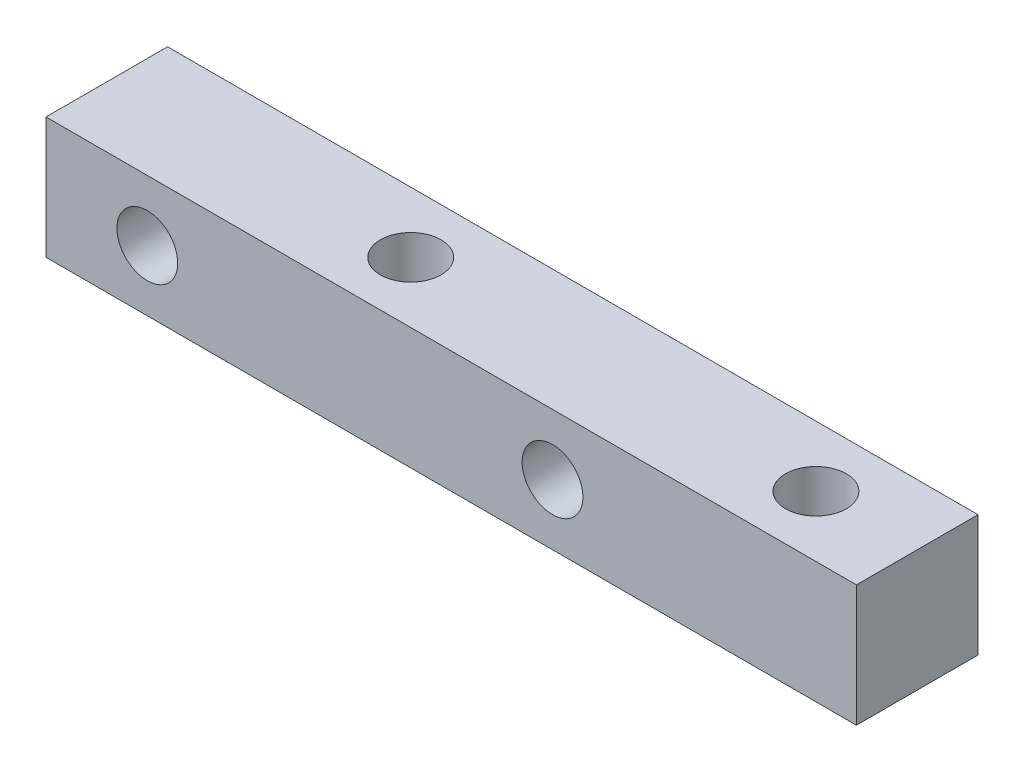
ISO-10303-21;
HEADER;
FILE_DESCRIPTION(('STEP AP214'),'2;1');
FILE_NAME('part.step','',(''),(''),'','','');
FILE_SCHEMA(('AUTOMOTIVE_DESIGN { 1 0 10303 214 1 1 1 1 }'));
ENDSEC;
DATA;
#1=APPLICATION_CONTEXT('core data for automotive mechanical design processes');
#2=APPLICATION_PROTOCOL_DEFINITION('international standard','automotive_design',2000,#1);
#3=PRODUCT_CONTEXT('',#1,'mechanical');
#4=PRODUCT('Part','Part','',(#3));
#5=PRODUCT_RELATED_PRODUCT_CATEGORY('part','',(#4));
#6=PRODUCT_DEFINITION_FORMATION('','',#4);
#7=PRODUCT_DEFINITION_CONTEXT('part definition',#1,'design');
#8=PRODUCT_DEFINITION('design','',#6,#7);
#9=PRODUCT_DEFINITION_SHAPE('','',#8);
#10=(LENGTH_UNIT() NAMED_UNIT(*) SI_UNIT(.MILLI.,.METRE.));
#11=(NAMED_UNIT(*) PLANE_ANGLE_UNIT() SI_UNIT($,.RADIAN.));
#12=(NAMED_UNIT(*) SI_UNIT($,.STERADIAN.) SOLID_ANGLE_UNIT());
#13=UNCERTAINTY_MEASURE_WITH_UNIT(LENGTH_MEASURE(1.E-05),#10,'distance_accuracy_value','');
#14=(GEOMETRIC_REPRESENTATION_CONTEXT(3) GLOBAL_UNCERTAINTY_ASSIGNED_CONTEXT((#13)) GLOBAL_UNIT_ASSIGNED_CONTEXT((#10,
#11,#12)) REPRESENTATION_CONTEXT('',''));
#15=CARTESIAN_POINT('',(0.,0.,0.));
#16=DIRECTION('',(0.,0.,1.));
#17=DIRECTION('',(1.,0.,0.));
#18=AXIS2_PLACEMENT_3D('',#15,#16,#17);
#19=CARTESIAN_POINT('',(0.,0.,6.));
#20=DIRECTION('',(0.,0.,-1.));
#21=DIRECTION('',(-1.,0.,0.));
#22=AXIS2_PLACEMENT_3D('',#19,#20,#21);
#23=PLANE('',#22);
#24=DIRECTION('',(0.,-1.,0.));
#25=VECTOR('',#24,1.);
#26=CARTESIAN_POINT('',(0.,0.,6.));
#27=LINE('',#26,#25);
#28=CARTESIAN_POINT('',(0.,6.,6.));
#29=VERTEX_POINT('',#28);
#30=CARTESIAN_POINT('',(0.,0.,6.));
#31=VERTEX_POINT('',#30);
#32=EDGE_CURVE('E94',#29,#31,#27,.T.);
#33=ORIENTED_EDGE('',*,*,#32,.T.);
#34=DIRECTION('',(1.,0.,0.));
#35=VECTOR('',#34,1.);
#36=CARTESIAN_POINT('',(0.,0.,6.));
#37=LINE('',#36,#35);
#38=CARTESIAN_POINT('',(40.,0.,6.));
#39=VERTEX_POINT('',#38);
#40=EDGE_CURVE('E89',#31,#39,#37,.T.);
#41=ORIENTED_EDGE('',*,*,#40,.T.);
#42=DIRECTION('',(0.,1.,0.));
#43=VECTOR('',#42,1.);
#44=CARTESIAN_POINT('',(40.,0.,6.));
#45=LINE('',#44,#43);
#46=CARTESIAN_POINT('',(40.,6.,6.));
#47=VERTEX_POINT('',#46);
#48=EDGE_CURVE('E92',#39,#47,#45,.T.);
#49=ORIENTED_EDGE('',*,*,#48,.T.);
#50=DIRECTION('',(-1.,0.,0.));
#51=VECTOR('',#50,1.);
#52=CARTESIAN_POINT('',(0.,6.,6.));
#53=LINE('',#52,#51);
#54=EDGE_CURVE('E59',#47,#29,#53,.T.);
#55=ORIENTED_EDGE('',*,*,#54,.T.);
#56=EDGE_LOOP('',(#33,#41,#49,#55));
#57=FACE_BOUND('',#56,.T.);
#58=CARTESIAN_POINT('',(5.,3.,6.));
#59=DIRECTION('',(0.,0.,1.));
#60=DIRECTION('',(1.,0.,0.));
#61=AXIS2_PLACEMENT_3D('',#58,#59,#60);
#62=CIRCLE('',#61,1.5);
#63=CARTESIAN_POINT('',(6.5,3.,6.));
#64=VERTEX_POINT('',#63);
#65=EDGE_CURVE('E109',#64,#64,#62,.T.);
#66=ORIENTED_EDGE('',*,*,#65,.F.);
#67=EDGE_LOOP('',(#66));
#68=FACE_BOUND('',#67,.T.);
#69=CARTESIAN_POINT('',(25.,3.,6.));
#70=DIRECTION('',(0.,0.,1.));
#71=DIRECTION('',(1.,0.,0.));
#72=AXIS2_PLACEMENT_3D('',#69,#70,#71);
#73=CIRCLE('',#72,1.5);
#74=CARTESIAN_POINT('',(26.5,3.,6.));
#75=VERTEX_POINT('',#74);
#76=EDGE_CURVE('E124',#75,#75,#73,.T.);
#77=ORIENTED_EDGE('',*,*,#76,.F.);
#78=EDGE_LOOP('',(#77));
#79=FACE_BOUND('',#78,.T.);
#80=ADVANCED_FACE('F42',(#57,#68,#79),#23,.F.);
#81=CARTESIAN_POINT('',(0.,0.,0.));
#82=DIRECTION('',(0.,0.,-1.));
#83=DIRECTION('',(-1.,0.,0.));
#84=AXIS2_PLACEMENT_3D('',#81,#82,#83);
#85=PLANE('',#84);
#86=CARTESIAN_POINT('',(5.,3.,0.));
#87=DIRECTION('',(0.,0.,1.));
#88=DIRECTION('',(1.,0.,0.));
#89=AXIS2_PLACEMENT_3D('',#86,#87,#88);
#90=CIRCLE('',#89,1.5);
#91=CARTESIAN_POINT('',(6.5,3.,0.));
#92=VERTEX_POINT('',#91);
#93=EDGE_CURVE('E121',#92,#92,#90,.T.);
#94=ORIENTED_EDGE('',*,*,#93,.T.);
#95=EDGE_LOOP('',(#94));
#96=FACE_BOUND('',#95,.T.);
#97=DIRECTION('',(0.,-1.,0.));
#98=VECTOR('',#97,1.);
#99=CARTESIAN_POINT('',(0.,0.,0.));
#100=LINE('',#99,#98);
#101=CARTESIAN_POINT('',(0.,6.,0.));
#102=VERTEX_POINT('',#101);
#103=CARTESIAN_POINT('',(0.,0.,0.));
#104=VERTEX_POINT('',#103);
#105=EDGE_CURVE('E106',#102,#104,#100,.T.);
#106=ORIENTED_EDGE('',*,*,#105,.F.);
#107=DIRECTION('',(-1.,0.,0.));
#108=VECTOR('',#107,1.);
#109=CARTESIAN_POINT('',(0.,6.,0.));
#110=LINE('',#109,#108);
#111=CARTESIAN_POINT('',(40.,6.,0.));
#112=VERTEX_POINT('',#111);
#113=EDGE_CURVE('E82',#112,#102,#110,.T.);
#114=ORIENTED_EDGE('',*,*,#113,.F.);
#115=DIRECTION('',(0.,1.,0.));
#116=VECTOR('',#115,1.);
#117=CARTESIAN_POINT('',(40.,0.,0.));
#118=LINE('',#117,#116);
#119=CARTESIAN_POINT('',(40.,0.,0.));
#120=VERTEX_POINT('',#119);
#121=EDGE_CURVE('E76',#120,#112,#118,.T.);
#122=ORIENTED_EDGE('',*,*,#121,.F.);
#123=DIRECTION('',(1.,0.,0.));
#124=VECTOR('',#123,1.);
#125=CARTESIAN_POINT('',(0.,0.,0.));
#126=LINE('',#125,#124);
#127=EDGE_CURVE('E98',#104,#120,#126,.T.);
#128=ORIENTED_EDGE('',*,*,#127,.F.);
#129=EDGE_LOOP('',(#106,#114,#122,#128));
#130=FACE_BOUND('',#129,.T.);
#131=CARTESIAN_POINT('',(25.,3.,0.));
#132=DIRECTION('',(0.,0.,1.));
#133=DIRECTION('',(1.,0.,0.));
#134=AXIS2_PLACEMENT_3D('',#131,#132,#133);
#135=CIRCLE('',#134,1.5);
#136=CARTESIAN_POINT('',(26.5,3.,0.));
#137=VERTEX_POINT('',#136);
#138=EDGE_CURVE('E127',#137,#137,#135,.T.);
#139=ORIENTED_EDGE('',*,*,#138,.T.);
#140=EDGE_LOOP('',(#139));
#141=FACE_BOUND('',#140,.T.);
#142=ADVANCED_FACE('F117',(#96,#130,#141),#85,.T.);
#143=CARTESIAN_POINT('',(0.,0.,6.));
#144=DIRECTION('',(1.,0.,0.));
#145=DIRECTION('',(0.,0.,-1.));
#146=AXIS2_PLACEMENT_3D('',#143,#144,#145);
#147=PLANE('',#146);
#148=ORIENTED_EDGE('',*,*,#105,.T.);
#149=DIRECTION('',(0.,0.,-1.));
#150=VECTOR('',#149,1.);
#151=CARTESIAN_POINT('',(0.,0.,6.));
#152=LINE('',#151,#150);
#153=EDGE_CURVE('E11',#31,#104,#152,.T.);
#154=ORIENTED_EDGE('',*,*,#153,.F.);
#155=ORIENTED_EDGE('',*,*,#32,.F.);
#156=DIRECTION('',(0.,0.,-1.));
#157=VECTOR('',#156,1.);
#158=CARTESIAN_POINT('',(0.,6.,6.));
#159=LINE('',#158,#157);
#160=EDGE_CURVE('E102',#29,#102,#159,.T.);
#161=ORIENTED_EDGE('',*,*,#160,.T.);
#162=EDGE_LOOP('',(#148,#154,#155,#161));
#163=FACE_BOUND('',#162,.T.);
#164=ADVANCED_FACE('F44',(#163),#147,.F.);
#165=CARTESIAN_POINT('',(0.,0.,6.));
#166=DIRECTION('',(0.,1.,0.));
#167=DIRECTION('',(0.,0.,1.));
#168=AXIS2_PLACEMENT_3D('',#165,#166,#167);
#169=PLANE('',#168);
#170=CARTESIAN_POINT('',(15.,0.,3.));
#171=DIRECTION('',(0.,1.,0.));
#172=DIRECTION('',(0.,0.,1.));
#173=AXIS2_PLACEMENT_3D('',#170,#171,#172);
#174=CIRCLE('',#173,1.5);
#175=CARTESIAN_POINT('',(15.,0.,4.5));
#176=VERTEX_POINT('',#175);
#177=EDGE_CURVE('E130',#176,#176,#174,.T.);
#178=ORIENTED_EDGE('',*,*,#177,.T.);
#179=EDGE_LOOP('',(#178));
#180=FACE_BOUND('',#179,.T.);
#181=CARTESIAN_POINT('',(35.,0.,3.));
#182=DIRECTION('',(0.,1.,0.));
#183=DIRECTION('',(0.,0.,1.));
#184=AXIS2_PLACEMENT_3D('',#181,#182,#183);
#185=CIRCLE('',#184,1.5);
#186=CARTESIAN_POINT('',(35.,0.,4.5));
#187=VERTEX_POINT('',#186);
#188=EDGE_CURVE('E136',#187,#187,#185,.T.);
#189=ORIENTED_EDGE('',*,*,#188,.T.);
#190=EDGE_LOOP('',(#189));
#191=FACE_BOUND('',#190,.T.);
#192=ORIENTED_EDGE('',*,*,#127,.T.);
#193=DIRECTION('',(0.,0.,-1.));
#194=VECTOR('',#193,1.);
#195=CARTESIAN_POINT('',(40.,0.,6.));
#196=LINE('',#195,#194);
#197=EDGE_CURVE('E51',#39,#120,#196,.T.);
#198=ORIENTED_EDGE('',*,*,#197,.F.);
#199=ORIENTED_EDGE('',*,*,#40,.F.);
#200=ORIENTED_EDGE('',*,*,#153,.T.);
#201=EDGE_LOOP('',(#192,#198,#199,#200));
#202=FACE_BOUND('',#201,.T.);
#203=ADVANCED_FACE('F97',(#180,#191,#202),#169,.F.);
#204=CARTESIAN_POINT('',(40.,0.,6.));
#205=DIRECTION('',(-1.,0.,0.));
#206=DIRECTION('',(0.,0.,1.));
#207=AXIS2_PLACEMENT_3D('',#204,#205,#206);
#208=PLANE('',#207);
#209=ORIENTED_EDGE('',*,*,#121,.T.);
#210=DIRECTION('',(0.,0.,-1.));
#211=VECTOR('',#210,1.);
#212=CARTESIAN_POINT('',(40.,6.,6.));
#213=LINE('',#212,#211);
#214=EDGE_CURVE('E99',#47,#112,#213,.T.);
#215=ORIENTED_EDGE('',*,*,#214,.F.);
#216=ORIENTED_EDGE('',*,*,#48,.F.);
#217=ORIENTED_EDGE('',*,*,#197,.T.);
#218=EDGE_LOOP('',(#209,#215,#216,#217));
#219=FACE_BOUND('',#218,.T.);
#220=ADVANCED_FACE('F100',(#219),#208,.F.);
#221=CARTESIAN_POINT('',(0.,6.,6.));
#222=DIRECTION('',(0.,-1.,0.));
#223=DIRECTION('',(0.,0.,-1.));
#224=AXIS2_PLACEMENT_3D('',#221,#222,#223);
#225=PLANE('',#224);
#226=CARTESIAN_POINT('',(15.,6.,3.));
#227=DIRECTION('',(0.,1.,0.));
#228=DIRECTION('',(0.,0.,1.));
#229=AXIS2_PLACEMENT_3D('',#226,#227,#228);
#230=CIRCLE('',#229,1.5);
#231=CARTESIAN_POINT('',(15.,6.,4.5));
#232=VERTEX_POINT('',#231);
#233=EDGE_CURVE('E139',#232,#232,#230,.T.);
#234=ORIENTED_EDGE('',*,*,#233,.F.);
#235=EDGE_LOOP('',(#234));
#236=FACE_BOUND('',#235,.T.);
#237=CARTESIAN_POINT('',(35.,6.,3.));
#238=DIRECTION('',(0.,1.,0.));
#239=DIRECTION('',(0.,0.,1.));
#240=AXIS2_PLACEMENT_3D('',#237,#238,#239);
#241=CIRCLE('',#240,1.5);
#242=CARTESIAN_POINT('',(35.,6.,4.5));
#243=VERTEX_POINT('',#242);
#244=EDGE_CURVE('E133',#243,#243,#241,.T.);
#245=ORIENTED_EDGE('',*,*,#244,.F.);
#246=EDGE_LOOP('',(#245));
#247=FACE_BOUND('',#246,.T.);
#248=ORIENTED_EDGE('',*,*,#113,.T.);
#249=ORIENTED_EDGE('',*,*,#160,.F.);
#250=ORIENTED_EDGE('',*,*,#54,.F.);
#251=ORIENTED_EDGE('',*,*,#214,.T.);
#252=EDGE_LOOP('',(#248,#249,#250,#251));
#253=FACE_BOUND('',#252,.T.);
#254=ADVANCED_FACE('F114',(#236,#247,#253),#225,.F.);
#255=CARTESIAN_POINT('',(5.,3.,6.));
#256=DIRECTION('',(0.,0.,-1.));
#257=DIRECTION('',(-1.,0.,0.));
#258=AXIS2_PLACEMENT_3D('',#255,#256,#257);
#259=CYLINDRICAL_SURFACE('',#258,1.5);
#260=ORIENTED_EDGE('',*,*,#65,.T.);
#261=EDGE_LOOP('',(#260));
#262=FACE_BOUND('',#261,.T.);
#263=ORIENTED_EDGE('',*,*,#93,.F.);
#264=EDGE_LOOP('',(#263));
#265=FACE_BOUND('',#264,.T.);
#266=ADVANCED_FACE('F156',(#262,#265),#259,.F.);
#267=CARTESIAN_POINT('',(25.,3.,6.));
#268=DIRECTION('',(0.,0.,-1.));
#269=DIRECTION('',(-1.,0.,0.));
#270=AXIS2_PLACEMENT_3D('',#267,#268,#269);
#271=CYLINDRICAL_SURFACE('',#270,1.5);
#272=ORIENTED_EDGE('',*,*,#76,.T.);
#273=EDGE_LOOP('',(#272));
#274=FACE_BOUND('',#273,.T.);
#275=ORIENTED_EDGE('',*,*,#138,.F.);
#276=EDGE_LOOP('',(#275));
#277=FACE_BOUND('',#276,.T.);
#278=ADVANCED_FACE('F161',(#274,#277),#271,.F.);
#279=CARTESIAN_POINT('',(35.,0.,3.));
#280=DIRECTION('',(0.,1.,0.));
#281=DIRECTION('',(0.,0.,1.));
#282=AXIS2_PLACEMENT_3D('',#279,#280,#281);
#283=CYLINDRICAL_SURFACE('',#282,1.5);
#284=ORIENTED_EDGE('',*,*,#188,.F.);
#285=EDGE_LOOP('',(#284));
#286=FACE_BOUND('',#285,.T.);
#287=ORIENTED_EDGE('',*,*,#244,.T.);
#288=EDGE_LOOP('',(#287));
#289=FACE_BOUND('',#288,.T.);
#290=ADVANCED_FACE('F150',(#286,#289),#283,.F.);
#291=CARTESIAN_POINT('',(15.,0.,3.));
#292=DIRECTION('',(0.,1.,0.));
#293=DIRECTION('',(0.,0.,1.));
#294=AXIS2_PLACEMENT_3D('',#291,#292,#293);
#295=CYLINDRICAL_SURFACE('',#294,1.5);
#296=ORIENTED_EDGE('',*,*,#177,.F.);
#297=EDGE_LOOP('',(#296));
#298=FACE_BOUND('',#297,.T.);
#299=ORIENTED_EDGE('',*,*,#233,.T.);
#300=EDGE_LOOP('',(#299));
#301=FACE_BOUND('',#300,.T.);
#302=ADVANCED_FACE('F147',(#298,#301),#295,.F.);
#303=CLOSED_SHELL('',(#80,#142,#164,#203,#220,#254,#266,#278,#290,#302));
#304=MANIFOLD_SOLID_BREP('B2',#303);
#305=ADVANCED_BREP_SHAPE_REPRESENTATION('',(#18,#304),#14);
#306=SHAPE_DEFINITION_REPRESENTATION(#9,#305);
ENDSEC;
END-ISO-10303-21;
